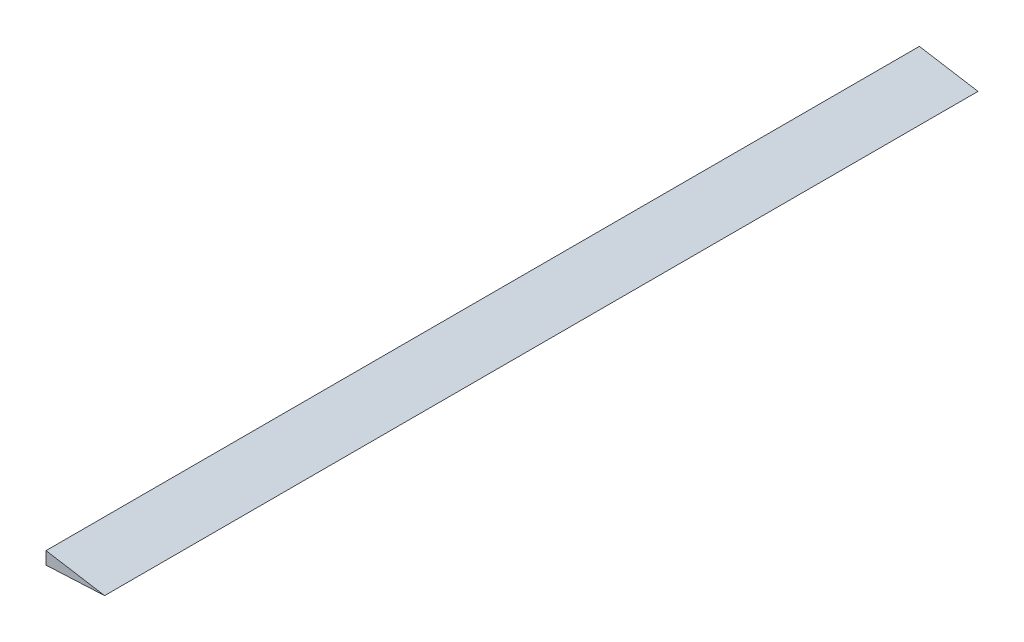
ISO-10303-21;
HEADER;
FILE_DESCRIPTION(('STEP AP214'),'2;1');
FILE_NAME('part.step','',(''),(''),'','','');
FILE_SCHEMA(('AUTOMOTIVE_DESIGN { 1 0 10303 214 1 1 1 1 }'));
ENDSEC;
DATA;
#1=APPLICATION_CONTEXT('core data for automotive mechanical design processes');
#2=APPLICATION_PROTOCOL_DEFINITION('international standard','automotive_design',2000,#1);
#3=PRODUCT_CONTEXT('',#1,'mechanical');
#4=PRODUCT('Part','Part','',(#3));
#5=PRODUCT_RELATED_PRODUCT_CATEGORY('part','',(#4));
#6=PRODUCT_DEFINITION_FORMATION('','',#4);
#7=PRODUCT_DEFINITION_CONTEXT('part definition',#1,'design');
#8=PRODUCT_DEFINITION('design','',#6,#7);
#9=PRODUCT_DEFINITION_SHAPE('','',#8);
#10=(LENGTH_UNIT() NAMED_UNIT(*) SI_UNIT(.MILLI.,.METRE.));
#11=(NAMED_UNIT(*) PLANE_ANGLE_UNIT() SI_UNIT($,.RADIAN.));
#12=(NAMED_UNIT(*) SI_UNIT($,.STERADIAN.) SOLID_ANGLE_UNIT());
#13=UNCERTAINTY_MEASURE_WITH_UNIT(LENGTH_MEASURE(1.E-05),#10,'distance_accuracy_value','');
#14=(GEOMETRIC_REPRESENTATION_CONTEXT(3) GLOBAL_UNCERTAINTY_ASSIGNED_CONTEXT((#13)) GLOBAL_UNIT_ASSIGNED_CONTEXT((#10,
#11,#12)) REPRESENTATION_CONTEXT('',''));
#15=CARTESIAN_POINT('',(0.,0.,0.));
#16=DIRECTION('',(0.,0.,1.));
#17=DIRECTION('',(1.,0.,0.));
#18=AXIS2_PLACEMENT_3D('',#15,#16,#17);
#19=CARTESIAN_POINT('',(274.102693551203,-2.52577255380021,46.881541819769));
#20=DIRECTION('',(0.0496585902517502,-0.998766251138978,0.));
#21=DIRECTION('',(0.998766251138978,0.0496585902517502,0.));
#22=AXIS2_PLACEMENT_3D('',#19,#20,#21);
#23=PLANE('',#22);
#24=DIRECTION('',(0.998766251138979,0.0496585902517502,0.));
#25=VECTOR('',#24,1.);
#26=CARTESIAN_POINT('',(274.102693551203,-2.52577255380021,-5.07999999999997));
#27=LINE('',#26,#25);
#28=CARTESIAN_POINT('',(274.102693551203,-2.52577255380021,-5.07999999999997));
#29=VERTEX_POINT('',#28);
#30=CARTESIAN_POINT('',(324.9026935512,0.,-5.07999999999997));
#31=VERTEX_POINT('',#30);
#32=EDGE_CURVE('E40',#29,#31,#27,.T.);
#33=ORIENTED_EDGE('',*,*,#32,.F.);
#34=DIRECTION('',(0.,0.,-1.));
#35=VECTOR('',#34,1.);
#36=CARTESIAN_POINT('',(274.102693551203,-2.52577255380021,46.881541819769));
#37=LINE('',#36,#35);
#38=CARTESIAN_POINT('',(274.102693551203,-2.52577255380021,-761.999746));
#39=VERTEX_POINT('',#38);
#40=EDGE_CURVE('E62',#29,#39,#37,.T.);
#41=ORIENTED_EDGE('',*,*,#40,.T.);
#42=DIRECTION('',(-0.998766251138978,-0.0496585902517502,0.));
#43=VECTOR('',#42,1.);
#44=CARTESIAN_POINT('',(274.102693551203,-2.52577255380021,-761.999746));
#45=LINE('',#44,#43);
#46=CARTESIAN_POINT('',(324.9026935512,0.,-761.999746));
#47=VERTEX_POINT('',#46);
#48=EDGE_CURVE('E66',#47,#39,#45,.T.);
#49=ORIENTED_EDGE('',*,*,#48,.F.);
#50=DIRECTION('',(0.,0.,-1.));
#51=VECTOR('',#50,1.);
#52=CARTESIAN_POINT('',(324.9026935512,0.,46.881541819769));
#53=LINE('',#52,#51);
#54=EDGE_CURVE('E84',#31,#47,#53,.T.);
#55=ORIENTED_EDGE('',*,*,#54,.F.);
#56=EDGE_LOOP('',(#33,#41,#49,#55));
#57=FACE_BOUND('',#56,.T.);
#58=ADVANCED_FACE('F33',(#57),#23,.T.);
#59=CARTESIAN_POINT('',(274.1026935512,8.39951134583515,46.881541819769));
#60=DIRECTION('',(0.163129854151705,0.986604607066298,0.));
#61=DIRECTION('',(-0.986604607066298,0.163129854151705,0.));
#62=AXIS2_PLACEMENT_3D('',#59,#60,#61);
#63=PLANE('',#62);
#64=DIRECTION('',(-0.986604607066298,0.163129854151705,0.));
#65=VECTOR('',#64,1.);
#66=CARTESIAN_POINT('',(274.1026935512,8.39951134583515,-5.07999999999997));
#67=LINE('',#66,#65);
#68=CARTESIAN_POINT('',(274.1026935512,8.39951134583515,-5.07999999999997));
#69=VERTEX_POINT('',#68);
#70=EDGE_CURVE('E86',#31,#69,#67,.T.);
#71=ORIENTED_EDGE('',*,*,#70,.F.);
#72=ORIENTED_EDGE('',*,*,#54,.T.);
#73=DIRECTION('',(0.986604607066297,-0.163129854151705,0.));
#74=VECTOR('',#73,1.);
#75=CARTESIAN_POINT('',(274.1026935512,8.39951134583515,-761.999746));
#76=LINE('',#75,#74);
#77=CARTESIAN_POINT('',(274.1026935512,8.39951134583515,-761.999746));
#78=VERTEX_POINT('',#77);
#79=EDGE_CURVE('E70',#78,#47,#76,.T.);
#80=ORIENTED_EDGE('',*,*,#79,.F.);
#81=DIRECTION('',(0.,0.,-1.));
#82=VECTOR('',#81,1.);
#83=CARTESIAN_POINT('',(274.1026935512,8.39951134583515,46.881541819769));
#84=LINE('',#83,#82);
#85=EDGE_CURVE('E69',#69,#78,#84,.T.);
#86=ORIENTED_EDGE('',*,*,#85,.F.);
#87=EDGE_LOOP('',(#71,#72,#80,#86));
#88=FACE_BOUND('',#87,.T.);
#89=ADVANCED_FACE('F89',(#88),#63,.T.);
#90=CARTESIAN_POINT('',(274.102693551203,-2.52577255380021,46.881541819769));
#91=DIRECTION('',(-1.,-2.64210970675256E-13,0.));
#92=DIRECTION('',(2.64210970675256E-13,-1.,0.));
#93=AXIS2_PLACEMENT_3D('',#90,#91,#92);
#94=PLANE('',#93);
#95=DIRECTION('',(2.64210970675256E-13,-1.,0.));
#96=VECTOR('',#95,1.);
#97=CARTESIAN_POINT('',(274.102693551203,-2.52577255380021,-5.07999999999997));
#98=LINE('',#97,#96);
#99=EDGE_CURVE('E11',#69,#29,#98,.T.);
#100=ORIENTED_EDGE('',*,*,#99,.F.);
#101=ORIENTED_EDGE('',*,*,#85,.T.);
#102=DIRECTION('',(-2.64210970675256E-13,1.,0.));
#103=VECTOR('',#102,1.);
#104=CARTESIAN_POINT('',(274.102693551203,-2.52577255380021,-761.999746));
#105=LINE('',#104,#103);
#106=EDGE_CURVE('E72',#39,#78,#105,.T.);
#107=ORIENTED_EDGE('',*,*,#106,.F.);
#108=ORIENTED_EDGE('',*,*,#40,.F.);
#109=EDGE_LOOP('',(#100,#101,#107,#108));
#110=FACE_BOUND('',#109,.T.);
#111=ADVANCED_FACE('F73',(#110),#94,.T.);
#112=CARTESIAN_POINT('',(0.,0.,-761.999746));
#113=DIRECTION('',(0.,0.,1.));
#114=DIRECTION('',(1.,0.,0.));
#115=AXIS2_PLACEMENT_3D('',#112,#113,#114);
#116=PLANE('',#115);
#117=ORIENTED_EDGE('',*,*,#48,.T.);
#118=ORIENTED_EDGE('',*,*,#106,.T.);
#119=ORIENTED_EDGE('',*,*,#79,.T.);
#120=EDGE_LOOP('',(#117,#118,#119));
#121=FACE_BOUND('',#120,.T.);
#122=ADVANCED_FACE('F78',(#121),#116,.F.);
#123=CARTESIAN_POINT('',(1.1516545592317,2.60088125935345,-5.07999999999997));
#124=DIRECTION('',(0.,0.,-1.));
#125=DIRECTION('',(-1.,0.,0.));
#126=AXIS2_PLACEMENT_3D('',#123,#124,#125);
#127=PLANE('',#126);
#128=ORIENTED_EDGE('',*,*,#32,.T.);
#129=ORIENTED_EDGE('',*,*,#70,.T.);
#130=ORIENTED_EDGE('',*,*,#99,.T.);
#131=EDGE_LOOP('',(#128,#129,#130));
#132=FACE_BOUND('',#131,.T.);
#133=ADVANCED_FACE('F88',(#132),#127,.F.);
#134=CLOSED_SHELL('',(#58,#89,#111,#122,#133));
#135=MANIFOLD_SOLID_BREP('B2',#134);
#136=ADVANCED_BREP_SHAPE_REPRESENTATION('',(#18,#135),#14);
#137=SHAPE_DEFINITION_REPRESENTATION(#9,#136);
ENDSEC;
END-ISO-10303-21;
